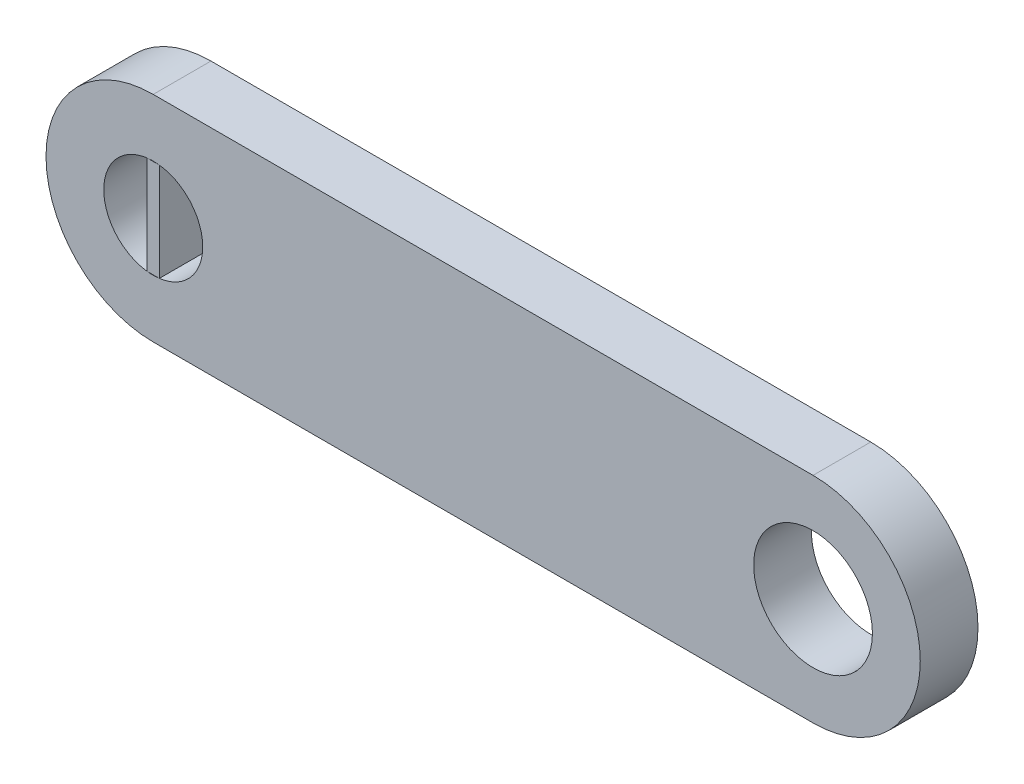
ISO-10303-21;
HEADER;
FILE_DESCRIPTION(('STEP AP214'),'2;1');
FILE_NAME('part.step','',(''),(''),'','','');
FILE_SCHEMA(('AUTOMOTIVE_DESIGN { 1 0 10303 214 1 1 1 1 }'));
ENDSEC;
DATA;
#1=APPLICATION_CONTEXT('core data for automotive mechanical design processes');
#2=APPLICATION_PROTOCOL_DEFINITION('international standard','automotive_design',2000,#1);
#3=PRODUCT_CONTEXT('',#1,'mechanical');
#4=PRODUCT('Part','Part','',(#3));
#5=PRODUCT_RELATED_PRODUCT_CATEGORY('part','',(#4));
#6=PRODUCT_DEFINITION_FORMATION('','',#4);
#7=PRODUCT_DEFINITION_CONTEXT('part definition',#1,'design');
#8=PRODUCT_DEFINITION('design','',#6,#7);
#9=PRODUCT_DEFINITION_SHAPE('','',#8);
#10=(LENGTH_UNIT() NAMED_UNIT(*) SI_UNIT(.MILLI.,.METRE.));
#11=(NAMED_UNIT(*) PLANE_ANGLE_UNIT() SI_UNIT($,.RADIAN.));
#12=(NAMED_UNIT(*) SI_UNIT($,.STERADIAN.) SOLID_ANGLE_UNIT());
#13=UNCERTAINTY_MEASURE_WITH_UNIT(LENGTH_MEASURE(1.E-05),#10,'distance_accuracy_value','');
#14=(GEOMETRIC_REPRESENTATION_CONTEXT(3) GLOBAL_UNCERTAINTY_ASSIGNED_CONTEXT((#13)) GLOBAL_UNIT_ASSIGNED_CONTEXT((#10,
#11,#12)) REPRESENTATION_CONTEXT('',''));
#15=CARTESIAN_POINT('',(0.,0.,0.));
#16=DIRECTION('',(0.,0.,1.));
#17=DIRECTION('',(1.,0.,0.));
#18=AXIS2_PLACEMENT_3D('',#15,#16,#17);
#19=CARTESIAN_POINT('',(-20.,0.,3.5));
#20=DIRECTION('',(0.,0.,-1.));
#21=DIRECTION('',(-1.,0.,0.));
#22=AXIS2_PLACEMENT_3D('',#19,#20,#21);
#23=CYLINDRICAL_SURFACE('',#22,3.);
#24=CARTESIAN_POINT('',(-20.,0.,3.5));
#25=DIRECTION('',(0.,0.,1.));
#26=DIRECTION('',(1.,0.,0.));
#27=AXIS2_PLACEMENT_3D('',#24,#25,#26);
#28=CIRCLE('',#27,3.);
#29=CARTESIAN_POINT('',(-17.,0.,3.5));
#30=VERTEX_POINT('',#29);
#31=EDGE_CURVE('E147',#30,#30,#28,.T.);
#32=ORIENTED_EDGE('',*,*,#31,.T.);
#33=EDGE_LOOP('',(#32));
#34=FACE_BOUND('',#33,.T.);
#35=CARTESIAN_POINT('',(-20.,0.,0.));
#36=DIRECTION('',(0.,0.,1.));
#37=DIRECTION('',(1.,0.,0.));
#38=AXIS2_PLACEMENT_3D('',#35,#36,#37);
#39=CIRCLE('',#38,3.);
#40=CARTESIAN_POINT('',(-17.,0.,0.));
#41=VERTEX_POINT('',#40);
#42=EDGE_CURVE('E80',#41,#41,#39,.T.);
#43=ORIENTED_EDGE('',*,*,#42,.F.);
#44=EDGE_LOOP('',(#43));
#45=FACE_BOUND('',#44,.T.);
#46=ADVANCED_FACE('F70',(#34,#45),#23,.F.);
#47=CARTESIAN_POINT('',(0.,-6.5,3.5));
#48=DIRECTION('',(0.,1.,0.));
#49=DIRECTION('',(0.,0.,1.));
#50=AXIS2_PLACEMENT_3D('',#47,#48,#49);
#51=PLANE('',#50);
#52=DIRECTION('',(1.,0.,0.));
#53=VECTOR('',#52,1.);
#54=CARTESIAN_POINT('',(0.,-6.5,0.));
#55=LINE('',#54,#53);
#56=CARTESIAN_POINT('',(-20.,-6.5,0.));
#57=VERTEX_POINT('',#56);
#58=CARTESIAN_POINT('',(20.,-6.5,0.));
#59=VERTEX_POINT('',#58);
#60=EDGE_CURVE('E132',#57,#59,#55,.T.);
#61=ORIENTED_EDGE('',*,*,#60,.T.);
#62=DIRECTION('',(0.,0.,-1.));
#63=VECTOR('',#62,1.);
#64=CARTESIAN_POINT('',(20.,-6.5,3.5));
#65=LINE('',#64,#63);
#66=CARTESIAN_POINT('',(20.,-6.5,3.5));
#67=VERTEX_POINT('',#66);
#68=EDGE_CURVE('E162',#67,#59,#65,.T.);
#69=ORIENTED_EDGE('',*,*,#68,.F.);
#70=DIRECTION('',(1.,0.,0.));
#71=VECTOR('',#70,1.);
#72=CARTESIAN_POINT('',(0.,-6.5,3.5));
#73=LINE('',#72,#71);
#74=CARTESIAN_POINT('',(-20.,-6.5,3.5));
#75=VERTEX_POINT('',#74);
#76=EDGE_CURVE('E146',#75,#67,#73,.T.);
#77=ORIENTED_EDGE('',*,*,#76,.F.);
#78=DIRECTION('',(0.,0.,-1.));
#79=VECTOR('',#78,1.);
#80=CARTESIAN_POINT('',(-20.,-6.5,3.5));
#81=LINE('',#80,#79);
#82=EDGE_CURVE('E126',#75,#57,#81,.T.);
#83=ORIENTED_EDGE('',*,*,#82,.T.);
#84=EDGE_LOOP('',(#61,#69,#77,#83));
#85=FACE_BOUND('',#84,.T.);
#86=ADVANCED_FACE('F163',(#85),#51,.F.);
#87=CARTESIAN_POINT('',(20.,0.,3.5));
#88=DIRECTION('',(0.,0.,-1.));
#89=DIRECTION('',(-1.,0.,0.));
#90=AXIS2_PLACEMENT_3D('',#87,#88,#89);
#91=CYLINDRICAL_SURFACE('',#90,6.5);
#92=CARTESIAN_POINT('',(20.,0.,0.));
#93=DIRECTION('',(0.,0.,1.));
#94=DIRECTION('',(1.,0.,0.));
#95=AXIS2_PLACEMENT_3D('',#92,#93,#94);
#96=CIRCLE('',#95,6.5);
#97=CARTESIAN_POINT('',(20.,6.5,0.));
#98=VERTEX_POINT('',#97);
#99=EDGE_CURVE('E89',#59,#98,#96,.T.);
#100=ORIENTED_EDGE('',*,*,#99,.T.);
#101=DIRECTION('',(0.,0.,-1.));
#102=VECTOR('',#101,1.);
#103=CARTESIAN_POINT('',(20.,6.5,3.5));
#104=LINE('',#103,#102);
#105=CARTESIAN_POINT('',(20.,6.5,3.5));
#106=VERTEX_POINT('',#105);
#107=EDGE_CURVE('E127',#106,#98,#104,.T.);
#108=ORIENTED_EDGE('',*,*,#107,.F.);
#109=CARTESIAN_POINT('',(20.,0.,3.5));
#110=DIRECTION('',(0.,0.,1.));
#111=DIRECTION('',(1.,0.,0.));
#112=AXIS2_PLACEMENT_3D('',#109,#110,#111);
#113=CIRCLE('',#112,6.5);
#114=EDGE_CURVE('E107',#67,#106,#113,.T.);
#115=ORIENTED_EDGE('',*,*,#114,.F.);
#116=ORIENTED_EDGE('',*,*,#68,.T.);
#117=EDGE_LOOP('',(#100,#108,#115,#116));
#118=FACE_BOUND('',#117,.T.);
#119=ADVANCED_FACE('F166',(#118),#91,.T.);
#120=CARTESIAN_POINT('',(0.,6.5,3.5));
#121=DIRECTION('',(0.,1.,0.));
#122=DIRECTION('',(0.,0.,1.));
#123=AXIS2_PLACEMENT_3D('',#120,#121,#122);
#124=PLANE('',#123);
#125=DIRECTION('',(1.,0.,0.));
#126=VECTOR('',#125,1.);
#127=CARTESIAN_POINT('',(0.,6.5,0.));
#128=LINE('',#127,#126);
#129=CARTESIAN_POINT('',(-20.,6.5,0.));
#130=VERTEX_POINT('',#129);
#131=EDGE_CURVE('E130',#130,#98,#128,.T.);
#132=ORIENTED_EDGE('',*,*,#131,.F.);
#133=DIRECTION('',(0.,0.,-1.));
#134=VECTOR('',#133,1.);
#135=CARTESIAN_POINT('',(-20.,6.5,3.5));
#136=LINE('',#135,#134);
#137=CARTESIAN_POINT('',(-20.,6.5,3.5));
#138=VERTEX_POINT('',#137);
#139=EDGE_CURVE('E120',#138,#130,#136,.T.);
#140=ORIENTED_EDGE('',*,*,#139,.F.);
#141=DIRECTION('',(1.,0.,0.));
#142=VECTOR('',#141,1.);
#143=CARTESIAN_POINT('',(0.,6.5,3.5));
#144=LINE('',#143,#142);
#145=EDGE_CURVE('E143',#138,#106,#144,.T.);
#146=ORIENTED_EDGE('',*,*,#145,.T.);
#147=ORIENTED_EDGE('',*,*,#107,.T.);
#148=EDGE_LOOP('',(#132,#140,#146,#147));
#149=FACE_BOUND('',#148,.T.);
#150=ADVANCED_FACE('F134',(#149),#124,.T.);
#151=CARTESIAN_POINT('',(20.,0.,3.5));
#152=DIRECTION('',(0.,0.,-1.));
#153=DIRECTION('',(-1.,0.,0.));
#154=AXIS2_PLACEMENT_3D('',#151,#152,#153);
#155=CYLINDRICAL_SURFACE('',#154,3.6);
#156=CARTESIAN_POINT('',(20.,0.,3.5));
#157=DIRECTION('',(0.,0.,1.));
#158=DIRECTION('',(1.,0.,0.));
#159=AXIS2_PLACEMENT_3D('',#156,#157,#158);
#160=CIRCLE('',#159,3.6);
#161=CARTESIAN_POINT('',(23.6,0.,3.5));
#162=VERTEX_POINT('',#161);
#163=EDGE_CURVE('E74',#162,#162,#160,.T.);
#164=ORIENTED_EDGE('',*,*,#163,.T.);
#165=EDGE_LOOP('',(#164));
#166=FACE_BOUND('',#165,.T.);
#167=CARTESIAN_POINT('',(20.,0.,0.));
#168=DIRECTION('',(0.,0.,1.));
#169=DIRECTION('',(1.,0.,0.));
#170=AXIS2_PLACEMENT_3D('',#167,#168,#169);
#171=CIRCLE('',#170,3.6);
#172=CARTESIAN_POINT('',(23.6,0.,0.));
#173=VERTEX_POINT('',#172);
#174=EDGE_CURVE('E13',#173,#173,#171,.T.);
#175=ORIENTED_EDGE('',*,*,#174,.F.);
#176=EDGE_LOOP('',(#175));
#177=FACE_BOUND('',#176,.T.);
#178=ADVANCED_FACE('F154',(#166,#177),#155,.F.);
#179=CARTESIAN_POINT('',(-20.,0.,3.5));
#180=DIRECTION('',(0.,0.,-1.));
#181=DIRECTION('',(-1.,0.,0.));
#182=AXIS2_PLACEMENT_3D('',#179,#180,#181);
#183=CYLINDRICAL_SURFACE('',#182,6.5);
#184=CARTESIAN_POINT('',(-20.,0.,0.));
#185=DIRECTION('',(0.,0.,1.));
#186=DIRECTION('',(1.,0.,0.));
#187=AXIS2_PLACEMENT_3D('',#184,#185,#186);
#188=CIRCLE('',#187,6.5);
#189=EDGE_CURVE('E117',#130,#57,#188,.T.);
#190=ORIENTED_EDGE('',*,*,#189,.T.);
#191=ORIENTED_EDGE('',*,*,#82,.F.);
#192=CARTESIAN_POINT('',(-20.,0.,3.5));
#193=DIRECTION('',(0.,0.,1.));
#194=DIRECTION('',(1.,0.,0.));
#195=AXIS2_PLACEMENT_3D('',#192,#193,#194);
#196=CIRCLE('',#195,6.5);
#197=EDGE_CURVE('E122',#138,#75,#196,.T.);
#198=ORIENTED_EDGE('',*,*,#197,.F.);
#199=ORIENTED_EDGE('',*,*,#139,.T.);
#200=EDGE_LOOP('',(#190,#191,#198,#199));
#201=FACE_BOUND('',#200,.T.);
#202=ADVANCED_FACE('F121',(#201),#183,.T.);
#203=CARTESIAN_POINT('',(0.,0.,3.5));
#204=DIRECTION('',(0.,0.,1.));
#205=DIRECTION('',(1.,0.,0.));
#206=AXIS2_PLACEMENT_3D('',#203,#204,#205);
#207=PLANE('',#206);
#208=ORIENTED_EDGE('',*,*,#163,.F.);
#209=EDGE_LOOP('',(#208));
#210=FACE_BOUND('',#209,.T.);
#211=ORIENTED_EDGE('',*,*,#31,.F.);
#212=EDGE_LOOP('',(#211));
#213=FACE_BOUND('',#212,.T.);
#214=ORIENTED_EDGE('',*,*,#76,.T.);
#215=ORIENTED_EDGE('',*,*,#114,.T.);
#216=ORIENTED_EDGE('',*,*,#145,.F.);
#217=ORIENTED_EDGE('',*,*,#197,.T.);
#218=EDGE_LOOP('',(#214,#215,#216,#217));
#219=FACE_BOUND('',#218,.T.);
#220=ADVANCED_FACE('F72',(#210,#213,#219),#207,.T.);
#221=CARTESIAN_POINT('',(0.,0.,0.));
#222=DIRECTION('',(0.,0.,1.));
#223=DIRECTION('',(1.,0.,0.));
#224=AXIS2_PLACEMENT_3D('',#221,#222,#223);
#225=PLANE('',#224);
#226=ORIENTED_EDGE('',*,*,#174,.T.);
#227=EDGE_LOOP('',(#226));
#228=FACE_BOUND('',#227,.T.);
#229=ORIENTED_EDGE('',*,*,#42,.T.);
#230=EDGE_LOOP('',(#229));
#231=FACE_BOUND('',#230,.T.);
#232=ORIENTED_EDGE('',*,*,#60,.F.);
#233=ORIENTED_EDGE('',*,*,#189,.F.);
#234=ORIENTED_EDGE('',*,*,#131,.T.);
#235=ORIENTED_EDGE('',*,*,#99,.F.);
#236=EDGE_LOOP('',(#232,#233,#234,#235));
#237=FACE_BOUND('',#236,.T.);
#238=ADVANCED_FACE('F129',(#228,#231,#237),#225,.F.);
#239=CLOSED_SHELL('',(#46,#86,#119,#150,#178,#202,#220,#238));
#240=MANIFOLD_SOLID_BREP('B2',#239);
#241=CARTESIAN_POINT('',(-20.375,2.97647022494766,3.5));
#242=DIRECTION('',(0.,1.,0.));
#243=DIRECTION('',(0.,0.,1.));
#244=AXIS2_PLACEMENT_3D('',#241,#242,#243);
#245=PLANE('',#244);
#246=DIRECTION('',(1.,0.,0.));
#247=VECTOR('',#246,1.);
#248=CARTESIAN_POINT('',(-20.375,2.97647022494766,0.));
#249=LINE('',#248,#247);
#250=CARTESIAN_POINT('',(-20.375,2.97647022494766,0.));
#251=VERTEX_POINT('',#250);
#252=CARTESIAN_POINT('',(-19.625,2.97647022494766,0.));
#253=VERTEX_POINT('',#252);
#254=EDGE_CURVE('E278',#251,#253,#249,.T.);
#255=ORIENTED_EDGE('',*,*,#254,.F.);
#256=DIRECTION('',(0.,0.,-1.));
#257=VECTOR('',#256,1.);
#258=CARTESIAN_POINT('',(-20.375,2.97647022494766,3.5));
#259=LINE('',#258,#257);
#260=CARTESIAN_POINT('',(-20.375,2.97647022494766,3.5));
#261=VERTEX_POINT('',#260);
#262=EDGE_CURVE('E68',#251,#261,#259,.F.);
#263=ORIENTED_EDGE('',*,*,#262,.T.);
#264=DIRECTION('',(1.,0.,0.));
#265=VECTOR('',#264,1.);
#266=CARTESIAN_POINT('',(-20.375,2.97647022494766,3.5));
#267=LINE('',#266,#265);
#268=CARTESIAN_POINT('',(-19.625,2.97647022494766,3.5));
#269=VERTEX_POINT('',#268);
#270=EDGE_CURVE('E281',#261,#269,#267,.T.);
#271=ORIENTED_EDGE('',*,*,#270,.T.);
#272=DIRECTION('',(0.,0.,-1.));
#273=VECTOR('',#272,1.);
#274=CARTESIAN_POINT('',(-19.625,2.97647022494766,3.5));
#275=LINE('',#274,#273);
#276=EDGE_CURVE('E276',#253,#269,#275,.F.);
#277=ORIENTED_EDGE('',*,*,#276,.F.);
#278=EDGE_LOOP('',(#255,#263,#271,#277));
#279=FACE_BOUND('',#278,.T.);
#280=ADVANCED_FACE('F235',(#279),#245,.T.);
#281=CARTESIAN_POINT('',(-20.375,2.97647022494766,3.5));
#282=DIRECTION('',(1.,0.,0.));
#283=DIRECTION('',(0.,0.,-1.));
#284=AXIS2_PLACEMENT_3D('',#281,#282,#283);
#285=PLANE('',#284);
#286=DIRECTION('',(0.,-1.,0.));
#287=VECTOR('',#286,1.);
#288=CARTESIAN_POINT('',(-20.375,2.97647022494766,0.));
#289=LINE('',#288,#287);
#290=CARTESIAN_POINT('',(-20.375,-2.97647022494767,0.));
#291=VERTEX_POINT('',#290);
#292=EDGE_CURVE('E238',#251,#291,#289,.T.);
#293=ORIENTED_EDGE('',*,*,#292,.T.);
#294=DIRECTION('',(0.,0.,-1.));
#295=VECTOR('',#294,1.);
#296=CARTESIAN_POINT('',(-20.375,-2.97647022494767,3.5));
#297=LINE('',#296,#295);
#298=CARTESIAN_POINT('',(-20.375,-2.97647022494767,3.5));
#299=VERTEX_POINT('',#298);
#300=EDGE_CURVE('E243',#291,#299,#297,.F.);
#301=ORIENTED_EDGE('',*,*,#300,.T.);
#302=DIRECTION('',(0.,-1.,0.));
#303=VECTOR('',#302,1.);
#304=CARTESIAN_POINT('',(-20.375,2.97647022494766,3.5));
#305=LINE('',#304,#303);
#306=EDGE_CURVE('E285',#261,#299,#305,.T.);
#307=ORIENTED_EDGE('',*,*,#306,.F.);
#308=ORIENTED_EDGE('',*,*,#262,.F.);
#309=EDGE_LOOP('',(#293,#301,#307,#308));
#310=FACE_BOUND('',#309,.T.);
#311=ADVANCED_FACE('F306',(#310),#285,.F.);
#312=CARTESIAN_POINT('',(-20.375,-2.97647022494767,3.5));
#313=DIRECTION('',(0.,1.,0.));
#314=DIRECTION('',(0.,0.,1.));
#315=AXIS2_PLACEMENT_3D('',#312,#313,#314);
#316=PLANE('',#315);
#317=DIRECTION('',(1.,0.,0.));
#318=VECTOR('',#317,1.);
#319=CARTESIAN_POINT('',(-20.375,-2.97647022494767,0.));
#320=LINE('',#319,#318);
#321=CARTESIAN_POINT('',(-19.625,-2.97647022494766,0.));
#322=VERTEX_POINT('',#321);
#323=EDGE_CURVE('E294',#291,#322,#320,.T.);
#324=ORIENTED_EDGE('',*,*,#323,.T.);
#325=DIRECTION('',(0.,0.,-1.));
#326=VECTOR('',#325,1.);
#327=CARTESIAN_POINT('',(-19.625,-2.97647022494766,3.5));
#328=LINE('',#327,#326);
#329=CARTESIAN_POINT('',(-19.625,-2.97647022494766,3.5));
#330=VERTEX_POINT('',#329);
#331=EDGE_CURVE('E251',#330,#322,#328,.T.);
#332=ORIENTED_EDGE('',*,*,#331,.F.);
#333=DIRECTION('',(1.,0.,0.));
#334=VECTOR('',#333,1.);
#335=CARTESIAN_POINT('',(-20.375,-2.97647022494767,3.5));
#336=LINE('',#335,#334);
#337=EDGE_CURVE('E299',#299,#330,#336,.T.);
#338=ORIENTED_EDGE('',*,*,#337,.F.);
#339=ORIENTED_EDGE('',*,*,#300,.F.);
#340=EDGE_LOOP('',(#324,#332,#338,#339));
#341=FACE_BOUND('',#340,.T.);
#342=ADVANCED_FACE('F309',(#341),#316,.F.);
#343=CARTESIAN_POINT('',(-19.625,2.97647022494766,3.5));
#344=DIRECTION('',(1.,0.,0.));
#345=DIRECTION('',(0.,0.,-1.));
#346=AXIS2_PLACEMENT_3D('',#343,#344,#345);
#347=PLANE('',#346);
#348=DIRECTION('',(0.,-1.,0.));
#349=VECTOR('',#348,1.);
#350=CARTESIAN_POINT('',(-19.625,2.97647022494766,0.));
#351=LINE('',#350,#349);
#352=EDGE_CURVE('E291',#253,#322,#351,.T.);
#353=ORIENTED_EDGE('',*,*,#352,.F.);
#354=ORIENTED_EDGE('',*,*,#276,.T.);
#355=DIRECTION('',(0.,-1.,0.));
#356=VECTOR('',#355,1.);
#357=CARTESIAN_POINT('',(-19.625,2.97647022494766,3.5));
#358=LINE('',#357,#356);
#359=EDGE_CURVE('E302',#269,#330,#358,.T.);
#360=ORIENTED_EDGE('',*,*,#359,.T.);
#361=ORIENTED_EDGE('',*,*,#331,.T.);
#362=EDGE_LOOP('',(#353,#354,#360,#361));
#363=FACE_BOUND('',#362,.T.);
#364=ADVANCED_FACE('F293',(#363),#347,.T.);
#365=CARTESIAN_POINT('',(0.,0.,3.5));
#366=DIRECTION('',(0.,0.,-1.));
#367=DIRECTION('',(-1.,0.,0.));
#368=AXIS2_PLACEMENT_3D('',#365,#366,#367);
#369=PLANE('',#368);
#370=ORIENTED_EDGE('',*,*,#270,.F.);
#371=ORIENTED_EDGE('',*,*,#306,.T.);
#372=ORIENTED_EDGE('',*,*,#337,.T.);
#373=ORIENTED_EDGE('',*,*,#359,.F.);
#374=EDGE_LOOP('',(#370,#371,#372,#373));
#375=FACE_BOUND('',#374,.T.);
#376=ADVANCED_FACE('F308',(#375),#369,.F.);
#377=CARTESIAN_POINT('',(0.,0.,0.));
#378=DIRECTION('',(0.,0.,-1.));
#379=DIRECTION('',(-1.,0.,0.));
#380=AXIS2_PLACEMENT_3D('',#377,#378,#379);
#381=PLANE('',#380);
#382=ORIENTED_EDGE('',*,*,#254,.T.);
#383=ORIENTED_EDGE('',*,*,#352,.T.);
#384=ORIENTED_EDGE('',*,*,#323,.F.);
#385=ORIENTED_EDGE('',*,*,#292,.F.);
#386=EDGE_LOOP('',(#382,#383,#384,#385));
#387=FACE_BOUND('',#386,.T.);
#388=ADVANCED_FACE('F289',(#387),#381,.T.);
#389=CLOSED_SHELL('',(#280,#311,#342,#364,#376,#388));
#390=MANIFOLD_SOLID_BREP('B7',#389);
#391=ADVANCED_BREP_SHAPE_REPRESENTATION('',(#18,#240,#390),#14);
#392=SHAPE_DEFINITION_REPRESENTATION(#9,#391);
ENDSEC;
END-ISO-10303-21;
